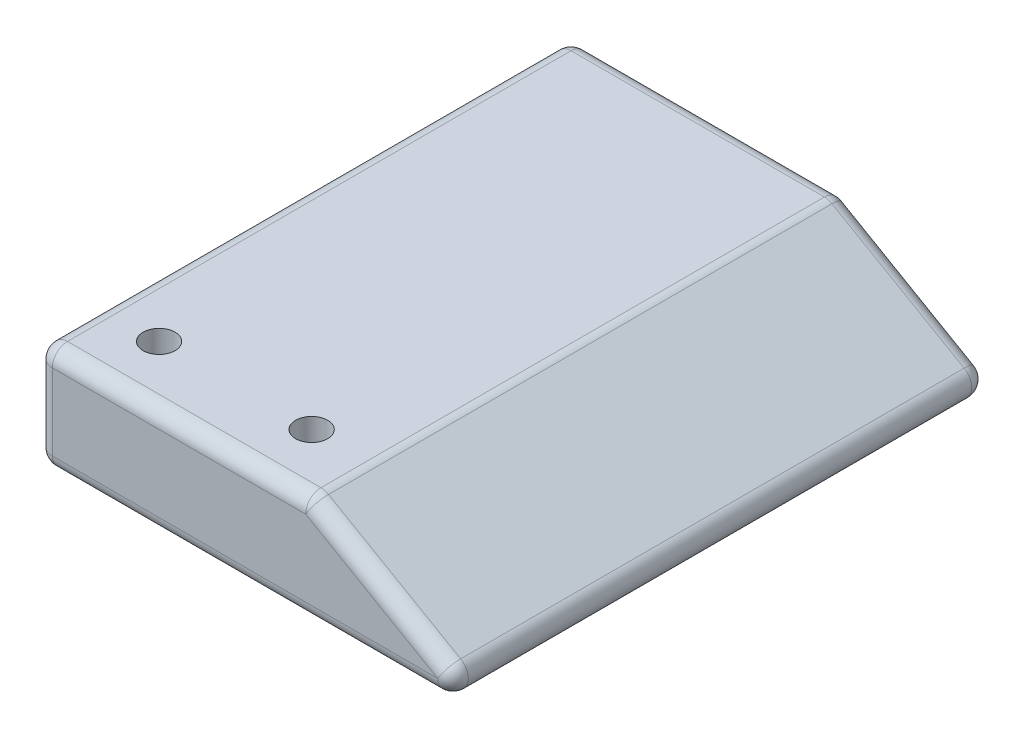
ISO-10303-21;
HEADER;
FILE_DESCRIPTION(('STEP AP214'),'2;1');
FILE_NAME('part.step','',(''),(''),'','','');
FILE_SCHEMA(('AUTOMOTIVE_DESIGN { 1 0 10303 214 1 1 1 1 }'));
ENDSEC;
DATA;
#1=APPLICATION_CONTEXT('core data for automotive mechanical design processes');
#2=APPLICATION_PROTOCOL_DEFINITION('international standard','automotive_design',2000,#1);
#3=PRODUCT_CONTEXT('',#1,'mechanical');
#4=PRODUCT('Part','Part','',(#3));
#5=PRODUCT_RELATED_PRODUCT_CATEGORY('part','',(#4));
#6=PRODUCT_DEFINITION_FORMATION('','',#4);
#7=PRODUCT_DEFINITION_CONTEXT('part definition',#1,'design');
#8=PRODUCT_DEFINITION('design','',#6,#7);
#9=PRODUCT_DEFINITION_SHAPE('','',#8);
#10=(LENGTH_UNIT() NAMED_UNIT(*) SI_UNIT(.MILLI.,.METRE.));
#11=(NAMED_UNIT(*) PLANE_ANGLE_UNIT() SI_UNIT($,.RADIAN.));
#12=(NAMED_UNIT(*) SI_UNIT($,.STERADIAN.) SOLID_ANGLE_UNIT());
#13=UNCERTAINTY_MEASURE_WITH_UNIT(LENGTH_MEASURE(1.E-05),#10,'distance_accuracy_value','');
#14=(GEOMETRIC_REPRESENTATION_CONTEXT(3) GLOBAL_UNCERTAINTY_ASSIGNED_CONTEXT((#13)) GLOBAL_UNIT_ASSIGNED_CONTEXT((#10,
#11,#12)) REPRESENTATION_CONTEXT('',''));
#15=CARTESIAN_POINT('',(0.,0.,0.));
#16=DIRECTION('',(0.,0.,1.));
#17=DIRECTION('',(1.,0.,0.));
#18=AXIS2_PLACEMENT_3D('',#15,#16,#17);
#19=CARTESIAN_POINT('',(60.,0.,70.));
#20=DIRECTION('',(0.,1.,0.));
#21=DIRECTION('',(0.,0.,1.));
#22=AXIS2_PLACEMENT_3D('',#19,#20,#21);
#23=PLANE('',#22);
#24=DIRECTION('',(1.,0.,0.));
#25=VECTOR('',#24,1.);
#26=CARTESIAN_POINT('',(60.,0.,2.));
#27=LINE('',#26,#25);
#28=CARTESIAN_POINT('',(2.,0.,2.));
#29=VERTEX_POINT('',#28);
#30=CARTESIAN_POINT('',(52.5358983848623,0.,2.));
#31=VERTEX_POINT('',#30);
#32=EDGE_CURVE('E183',#29,#31,#27,.T.);
#33=ORIENTED_EDGE('',*,*,#32,.T.);
#34=DIRECTION('',(0.,0.,-1.));
#35=VECTOR('',#34,1.);
#36=CARTESIAN_POINT('',(52.5358983848623,0.,70.));
#37=LINE('',#36,#35);
#38=CARTESIAN_POINT('',(52.5358983848623,0.,68.));
#39=VERTEX_POINT('',#38);
#40=EDGE_CURVE('E186',#31,#39,#37,.F.);
#41=ORIENTED_EDGE('',*,*,#40,.T.);
#42=DIRECTION('',(1.,0.,0.));
#43=VECTOR('',#42,1.);
#44=CARTESIAN_POINT('',(60.,0.,68.));
#45=LINE('',#44,#43);
#46=CARTESIAN_POINT('',(2.,0.,68.));
#47=VERTEX_POINT('',#46);
#48=EDGE_CURVE('E180',#39,#47,#45,.F.);
#49=ORIENTED_EDGE('',*,*,#48,.T.);
#50=DIRECTION('',(0.,0.,-1.));
#51=VECTOR('',#50,1.);
#52=CARTESIAN_POINT('',(2.,0.,70.));
#53=LINE('',#52,#51);
#54=EDGE_CURVE('E177',#47,#29,#53,.T.);
#55=ORIENTED_EDGE('',*,*,#54,.T.);
#56=EDGE_LOOP('',(#33,#41,#49,#55));
#57=FACE_BOUND('',#56,.T.);
#58=ADVANCED_FACE('F45',(#57),#23,.F.);
#59=CARTESIAN_POINT('',(35.7512886940358,14.,70.));
#60=DIRECTION('',(-0.500000000000001,-0.866025403784438,0.));
#61=DIRECTION('',(0.866025403784438,-0.500000000000001,0.));
#62=AXIS2_PLACEMENT_3D('',#59,#60,#61);
#63=PLANE('',#62);
#64=DIRECTION('',(0.,0.,-1.));
#65=VECTOR('',#64,1.);
#66=CARTESIAN_POINT('',(53.5358983848623,3.73205080756888,70.));
#67=LINE('',#66,#65);
#68=CARTESIAN_POINT('',(53.5358983848623,3.73205080756887,68.));
#69=VERTEX_POINT('',#68);
#70=CARTESIAN_POINT('',(53.5358983848623,3.73205080756887,2.));
#71=VERTEX_POINT('',#70);
#72=EDGE_CURVE('E170',#69,#71,#67,.T.);
#73=ORIENTED_EDGE('',*,*,#72,.T.);
#74=DIRECTION('',(-0.866025403784438,0.500000000000001,0.));
#75=VECTOR('',#74,1.);
#76=CARTESIAN_POINT('',(35.7512886940358,14.,2.));
#77=LINE('',#76,#75);
#78=CARTESIAN_POINT('',(36.2153903091736,13.7320508075689,2.));
#79=VERTEX_POINT('',#78);
#80=EDGE_CURVE('E174',#71,#79,#77,.T.);
#81=ORIENTED_EDGE('',*,*,#80,.T.);
#82=DIRECTION('',(0.,0.,-1.));
#83=VECTOR('',#82,1.);
#84=CARTESIAN_POINT('',(36.2153903091736,13.7320508075689,70.));
#85=LINE('',#84,#83);
#86=CARTESIAN_POINT('',(36.2153903091736,13.7320508075689,68.));
#87=VERTEX_POINT('',#86);
#88=EDGE_CURVE('E167',#79,#87,#85,.F.);
#89=ORIENTED_EDGE('',*,*,#88,.T.);
#90=DIRECTION('',(-0.866025403784438,0.500000000000001,0.));
#91=VECTOR('',#90,1.);
#92=CARTESIAN_POINT('',(35.7512886940358,14.,68.));
#93=LINE('',#92,#91);
#94=EDGE_CURVE('E164',#87,#69,#93,.F.);
#95=ORIENTED_EDGE('',*,*,#94,.T.);
#96=EDGE_LOOP('',(#73,#81,#89,#95));
#97=FACE_BOUND('',#96,.T.);
#98=ADVANCED_FACE('F359',(#97),#63,.F.);
#99=CARTESIAN_POINT('',(0.,14.,70.));
#100=DIRECTION('',(0.,-1.,0.));
#101=DIRECTION('',(0.,0.,-1.));
#102=AXIS2_PLACEMENT_3D('',#99,#100,#101);
#103=PLANE('',#102);
#104=CARTESIAN_POINT('',(8.,14.,62.));
#105=DIRECTION('',(0.,1.,0.));
#106=DIRECTION('',(0.,0.,1.));
#107=AXIS2_PLACEMENT_3D('',#104,#105,#106);
#108=CIRCLE('',#107,2.1);
#109=CARTESIAN_POINT('',(8.,14.,64.1));
#110=VERTEX_POINT('',#109);
#111=EDGE_CURVE('E150',#110,#110,#108,.T.);
#112=ORIENTED_EDGE('',*,*,#111,.F.);
#113=EDGE_LOOP('',(#112));
#114=FACE_BOUND('',#113,.T.);
#115=CARTESIAN_POINT('',(28.,14.,62.));
#116=DIRECTION('',(0.,1.,0.));
#117=DIRECTION('',(0.,0.,1.));
#118=AXIS2_PLACEMENT_3D('',#115,#116,#117);
#119=CIRCLE('',#118,2.1);
#120=CARTESIAN_POINT('',(28.,14.,64.1));
#121=VERTEX_POINT('',#120);
#122=EDGE_CURVE('E149',#121,#121,#119,.T.);
#123=ORIENTED_EDGE('',*,*,#122,.F.);
#124=EDGE_LOOP('',(#123));
#125=FACE_BOUND('',#124,.T.);
#126=DIRECTION('',(-1.,0.,0.));
#127=VECTOR('',#126,1.);
#128=CARTESIAN_POINT('',(0.,14.,68.));
#129=LINE('',#128,#127);
#130=CARTESIAN_POINT('',(2.,14.,68.));
#131=VERTEX_POINT('',#130);
#132=CARTESIAN_POINT('',(35.2153903091736,14.,68.));
#133=VERTEX_POINT('',#132);
#134=EDGE_CURVE('E193',#131,#133,#129,.F.);
#135=ORIENTED_EDGE('',*,*,#134,.T.);
#136=DIRECTION('',(0.,0.,-1.));
#137=VECTOR('',#136,1.);
#138=CARTESIAN_POINT('',(35.2153903091736,14.,70.));
#139=LINE('',#138,#137);
#140=CARTESIAN_POINT('',(35.2153903091736,14.,2.));
#141=VERTEX_POINT('',#140);
#142=EDGE_CURVE('E199',#133,#141,#139,.T.);
#143=ORIENTED_EDGE('',*,*,#142,.T.);
#144=DIRECTION('',(-1.,0.,0.));
#145=VECTOR('',#144,1.);
#146=CARTESIAN_POINT('',(0.,14.,2.));
#147=LINE('',#146,#145);
#148=CARTESIAN_POINT('',(2.,14.,2.));
#149=VERTEX_POINT('',#148);
#150=EDGE_CURVE('E196',#141,#149,#147,.T.);
#151=ORIENTED_EDGE('',*,*,#150,.T.);
#152=DIRECTION('',(0.,0.,-1.));
#153=VECTOR('',#152,1.);
#154=CARTESIAN_POINT('',(2.,14.,70.));
#155=LINE('',#154,#153);
#156=EDGE_CURVE('E190',#149,#131,#155,.F.);
#157=ORIENTED_EDGE('',*,*,#156,.T.);
#158=EDGE_LOOP('',(#135,#143,#151,#157));
#159=FACE_BOUND('',#158,.T.);
#160=ADVANCED_FACE('F369',(#114,#125,#159),#103,.F.);
#161=CARTESIAN_POINT('',(0.,0.,70.));
#162=DIRECTION('',(1.,0.,0.));
#163=DIRECTION('',(0.,0.,-1.));
#164=AXIS2_PLACEMENT_3D('',#161,#162,#163);
#165=PLANE('',#164);
#166=DIRECTION('',(0.,-1.,0.));
#167=VECTOR('',#166,1.);
#168=CARTESIAN_POINT('',(0.,0.,68.));
#169=LINE('',#168,#167);
#170=CARTESIAN_POINT('',(0.,2.,68.));
#171=VERTEX_POINT('',#170);
#172=CARTESIAN_POINT('',(0.,12.,68.));
#173=VERTEX_POINT('',#172);
#174=EDGE_CURVE('E55',#171,#173,#169,.F.);
#175=ORIENTED_EDGE('',*,*,#174,.T.);
#176=DIRECTION('',(0.,0.,-1.));
#177=VECTOR('',#176,1.);
#178=CARTESIAN_POINT('',(0.,12.,70.));
#179=LINE('',#178,#177);
#180=CARTESIAN_POINT('',(0.,12.,2.));
#181=VERTEX_POINT('',#180);
#182=EDGE_CURVE('E11',#173,#181,#179,.T.);
#183=ORIENTED_EDGE('',*,*,#182,.T.);
#184=DIRECTION('',(0.,-1.,0.));
#185=VECTOR('',#184,1.);
#186=CARTESIAN_POINT('',(0.,0.,2.));
#187=LINE('',#186,#185);
#188=CARTESIAN_POINT('',(0.,2.,2.));
#189=VERTEX_POINT('',#188);
#190=EDGE_CURVE('E229',#181,#189,#187,.T.);
#191=ORIENTED_EDGE('',*,*,#190,.T.);
#192=DIRECTION('',(0.,0.,-1.));
#193=VECTOR('',#192,1.);
#194=CARTESIAN_POINT('',(0.,2.,70.));
#195=LINE('',#194,#193);
#196=EDGE_CURVE('E66',#189,#171,#195,.F.);
#197=ORIENTED_EDGE('',*,*,#196,.T.);
#198=EDGE_LOOP('',(#175,#183,#191,#197));
#199=FACE_BOUND('',#198,.T.);
#200=ADVANCED_FACE('F370',(#199),#165,.F.);
#201=CARTESIAN_POINT('',(0.,0.,70.));
#202=DIRECTION('',(0.,0.,-1.));
#203=DIRECTION('',(-1.,0.,0.));
#204=AXIS2_PLACEMENT_3D('',#201,#202,#203);
#205=PLANE('',#204);
#206=DIRECTION('',(-0.866025403784438,0.500000000000001,0.));
#207=VECTOR('',#206,1.);
#208=CARTESIAN_POINT('',(14.0000000000001,24.2487113059643,70.));
#209=LINE('',#208,#207);
#210=CARTESIAN_POINT('',(52.5358983848623,2.,70.));
#211=VERTEX_POINT('',#210);
#212=CARTESIAN_POINT('',(35.2153903091736,12.,70.));
#213=VERTEX_POINT('',#212);
#214=EDGE_CURVE('E222',#211,#213,#209,.T.);
#215=ORIENTED_EDGE('',*,*,#214,.T.);
#216=DIRECTION('',(-1.,0.,0.));
#217=VECTOR('',#216,1.);
#218=CARTESIAN_POINT('',(0.,12.,70.));
#219=LINE('',#218,#217);
#220=CARTESIAN_POINT('',(2.,12.,70.));
#221=VERTEX_POINT('',#220);
#222=EDGE_CURVE('E225',#213,#221,#219,.T.);
#223=ORIENTED_EDGE('',*,*,#222,.T.);
#224=DIRECTION('',(0.,-1.,0.));
#225=VECTOR('',#224,1.);
#226=CARTESIAN_POINT('',(2.,0.,70.));
#227=LINE('',#226,#225);
#228=CARTESIAN_POINT('',(2.,2.,70.));
#229=VERTEX_POINT('',#228);
#230=EDGE_CURVE('E216',#221,#229,#227,.T.);
#231=ORIENTED_EDGE('',*,*,#230,.T.);
#232=DIRECTION('',(1.,0.,0.));
#233=VECTOR('',#232,1.);
#234=CARTESIAN_POINT('',(0.,2.,70.));
#235=LINE('',#234,#233);
#236=EDGE_CURVE('E219',#229,#211,#235,.T.);
#237=ORIENTED_EDGE('',*,*,#236,.T.);
#238=EDGE_LOOP('',(#215,#223,#231,#237));
#239=FACE_BOUND('',#238,.T.);
#240=ADVANCED_FACE('F341',(#239),#205,.F.);
#241=CARTESIAN_POINT('',(0.,0.,0.));
#242=DIRECTION('',(0.,0.,-1.));
#243=DIRECTION('',(-1.,0.,0.));
#244=AXIS2_PLACEMENT_3D('',#241,#242,#243);
#245=PLANE('',#244);
#246=DIRECTION('',(-1.,0.,0.));
#247=VECTOR('',#246,1.);
#248=CARTESIAN_POINT('',(35.7512886940358,12.,0.));
#249=LINE('',#248,#247);
#250=CARTESIAN_POINT('',(2.,12.,0.));
#251=VERTEX_POINT('',#250);
#252=CARTESIAN_POINT('',(35.2153903091736,12.,0.));
#253=VERTEX_POINT('',#252);
#254=EDGE_CURVE('E209',#251,#253,#249,.F.);
#255=ORIENTED_EDGE('',*,*,#254,.T.);
#256=DIRECTION('',(-0.866025403784438,0.500000000000001,0.));
#257=VECTOR('',#256,1.);
#258=CARTESIAN_POINT('',(59.,-1.73205080756888,0.));
#259=LINE('',#258,#257);
#260=CARTESIAN_POINT('',(52.5358983848623,2.,0.));
#261=VERTEX_POINT('',#260);
#262=EDGE_CURVE('E212',#253,#261,#259,.F.);
#263=ORIENTED_EDGE('',*,*,#262,.T.);
#264=DIRECTION('',(1.,0.,0.));
#265=VECTOR('',#264,1.);
#266=CARTESIAN_POINT('',(0.,2.,0.));
#267=LINE('',#266,#265);
#268=CARTESIAN_POINT('',(2.,2.,0.));
#269=VERTEX_POINT('',#268);
#270=EDGE_CURVE('E206',#261,#269,#267,.F.);
#271=ORIENTED_EDGE('',*,*,#270,.T.);
#272=DIRECTION('',(0.,-1.,0.));
#273=VECTOR('',#272,1.);
#274=CARTESIAN_POINT('',(2.,14.,0.));
#275=LINE('',#274,#273);
#276=EDGE_CURVE('E203',#269,#251,#275,.F.);
#277=ORIENTED_EDGE('',*,*,#276,.T.);
#278=EDGE_LOOP('',(#255,#263,#271,#277));
#279=FACE_BOUND('',#278,.T.);
#280=ADVANCED_FACE('F575',(#279),#245,.T.);
#281=CARTESIAN_POINT('',(2.,12.,70.));
#282=DIRECTION('',(0.,0.,-1.));
#283=DIRECTION('',(-1.,0.,0.));
#284=AXIS2_PLACEMENT_3D('',#281,#282,#283);
#285=CYLINDRICAL_SURFACE('',#284,2.);
#286=CARTESIAN_POINT('',(2.,12.,68.));
#287=DIRECTION('',(0.,0.,1.));
#288=DIRECTION('',(1.,0.,0.));
#289=AXIS2_PLACEMENT_3D('',#286,#287,#288);
#290=CIRCLE('',#289,2.);
#291=EDGE_CURVE('E49',#131,#173,#290,.T.);
#292=ORIENTED_EDGE('',*,*,#291,.F.);
#293=ORIENTED_EDGE('',*,*,#156,.F.);
#294=CARTESIAN_POINT('',(2.,12.,2.));
#295=DIRECTION('',(0.,0.,-1.));
#296=DIRECTION('',(-1.,0.,0.));
#297=AXIS2_PLACEMENT_3D('',#294,#295,#296);
#298=CIRCLE('',#297,2.);
#299=EDGE_CURVE('E318',#181,#149,#298,.T.);
#300=ORIENTED_EDGE('',*,*,#299,.F.);
#301=ORIENTED_EDGE('',*,*,#182,.F.);
#302=EDGE_LOOP('',(#292,#293,#300,#301));
#303=FACE_BOUND('',#302,.T.);
#304=ADVANCED_FACE('F47',(#303),#285,.T.);
#305=CARTESIAN_POINT('',(2.,12.,68.));
#306=DIRECTION('',(0.,0.,1.));
#307=DIRECTION('',(1.,0.,0.));
#308=AXIS2_PLACEMENT_3D('',#305,#306,#307);
#309=SPHERICAL_SURFACE('',#308,2.);
#310=CARTESIAN_POINT('',(2.,12.,68.));
#311=DIRECTION('',(-1.,0.,0.));
#312=DIRECTION('',(0.,0.,1.));
#313=AXIS2_PLACEMENT_3D('',#310,#311,#312);
#314=CIRCLE('',#313,2.);
#315=EDGE_CURVE('E311',#131,#221,#314,.F.);
#316=ORIENTED_EDGE('',*,*,#315,.F.);
#317=ORIENTED_EDGE('',*,*,#291,.T.);
#318=CARTESIAN_POINT('',(2.,12.,68.));
#319=DIRECTION('',(0.,1.,0.));
#320=DIRECTION('',(0.,0.,1.));
#321=AXIS2_PLACEMENT_3D('',#318,#319,#320);
#322=CIRCLE('',#321,2.);
#323=EDGE_CURVE('E315',#221,#173,#322,.F.);
#324=ORIENTED_EDGE('',*,*,#323,.F.);
#325=EDGE_LOOP('',(#316,#317,#324));
#326=FACE_BOUND('',#325,.T.);
#327=ADVANCED_FACE('F331',(#326),#309,.T.);
#328=CARTESIAN_POINT('',(2.,12.,2.));
#329=DIRECTION('',(0.,0.,1.));
#330=DIRECTION('',(1.,0.,0.));
#331=AXIS2_PLACEMENT_3D('',#328,#329,#330);
#332=SPHERICAL_SURFACE('',#331,2.);
#333=CARTESIAN_POINT('',(2.,12.,2.));
#334=DIRECTION('',(0.,1.,0.));
#335=DIRECTION('',(0.,0.,1.));
#336=AXIS2_PLACEMENT_3D('',#333,#334,#335);
#337=CIRCLE('',#336,2.);
#338=EDGE_CURVE('E303',#181,#251,#337,.F.);
#339=ORIENTED_EDGE('',*,*,#338,.F.);
#340=ORIENTED_EDGE('',*,*,#299,.T.);
#341=CARTESIAN_POINT('',(2.,12.,2.));
#342=DIRECTION('',(-1.,0.,0.));
#343=DIRECTION('',(0.,0.,1.));
#344=AXIS2_PLACEMENT_3D('',#341,#342,#343);
#345=CIRCLE('',#344,2.);
#346=EDGE_CURVE('E307',#251,#149,#345,.F.);
#347=ORIENTED_EDGE('',*,*,#346,.F.);
#348=EDGE_LOOP('',(#339,#340,#347));
#349=FACE_BOUND('',#348,.T.);
#350=ADVANCED_FACE('F412',(#349),#332,.T.);
#351=CARTESIAN_POINT('',(2.,0.,68.));
#352=DIRECTION('',(0.,-1.,0.));
#353=DIRECTION('',(0.,0.,-1.));
#354=AXIS2_PLACEMENT_3D('',#351,#352,#353);
#355=CYLINDRICAL_SURFACE('',#354,2.);
#356=ORIENTED_EDGE('',*,*,#323,.T.);
#357=ORIENTED_EDGE('',*,*,#174,.F.);
#358=CARTESIAN_POINT('',(2.,2.,68.));
#359=DIRECTION('',(0.,-1.,0.));
#360=DIRECTION('',(0.,0.,-1.));
#361=AXIS2_PLACEMENT_3D('',#358,#359,#360);
#362=CIRCLE('',#361,2.);
#363=EDGE_CURVE('E295',#229,#171,#362,.T.);
#364=ORIENTED_EDGE('',*,*,#363,.F.);
#365=ORIENTED_EDGE('',*,*,#230,.F.);
#366=EDGE_LOOP('',(#356,#357,#364,#365));
#367=FACE_BOUND('',#366,.T.);
#368=ADVANCED_FACE('F336',(#367),#355,.T.);
#369=CARTESIAN_POINT('',(0.,12.,68.));
#370=DIRECTION('',(-1.,0.,0.));
#371=DIRECTION('',(0.,0.,1.));
#372=AXIS2_PLACEMENT_3D('',#369,#370,#371);
#373=CYLINDRICAL_SURFACE('',#372,2.);
#374=ORIENTED_EDGE('',*,*,#315,.T.);
#375=ORIENTED_EDGE('',*,*,#222,.F.);
#376=CARTESIAN_POINT('',(35.2153903091736,12.,68.));
#377=DIRECTION('',(1.,0.,0.));
#378=DIRECTION('',(0.,0.,-1.));
#379=AXIS2_PLACEMENT_3D('',#376,#377,#378);
#380=CIRCLE('',#379,2.);
#381=EDGE_CURVE('E291',#133,#213,#380,.T.);
#382=ORIENTED_EDGE('',*,*,#381,.F.);
#383=ORIENTED_EDGE('',*,*,#134,.F.);
#384=EDGE_LOOP('',(#374,#375,#382,#383));
#385=FACE_BOUND('',#384,.T.);
#386=ADVANCED_FACE('F347',(#385),#373,.T.);
#387=CARTESIAN_POINT('',(35.2153903091736,12.,70.));
#388=DIRECTION('',(0.,0.,-1.));
#389=DIRECTION('',(-1.,0.,0.));
#390=AXIS2_PLACEMENT_3D('',#387,#388,#389);
#391=CYLINDRICAL_SURFACE('',#390,2.);
#392=CARTESIAN_POINT('',(35.2153903091736,12.,2.));
#393=DIRECTION('',(0.,0.,-1.));
#394=DIRECTION('',(-1.,0.,0.));
#395=AXIS2_PLACEMENT_3D('',#392,#393,#394);
#396=CIRCLE('',#395,2.);
#397=EDGE_CURVE('E283',#141,#79,#396,.T.);
#398=ORIENTED_EDGE('',*,*,#397,.F.);
#399=ORIENTED_EDGE('',*,*,#142,.F.);
#400=CARTESIAN_POINT('',(35.2153903091736,12.,68.));
#401=DIRECTION('',(0.,0.,1.));
#402=DIRECTION('',(1.,0.,0.));
#403=AXIS2_PLACEMENT_3D('',#400,#401,#402);
#404=CIRCLE('',#403,2.);
#405=EDGE_CURVE('E287',#87,#133,#404,.T.);
#406=ORIENTED_EDGE('',*,*,#405,.F.);
#407=ORIENTED_EDGE('',*,*,#88,.F.);
#408=EDGE_LOOP('',(#398,#399,#406,#407));
#409=FACE_BOUND('',#408,.T.);
#410=ADVANCED_FACE('F366',(#409),#391,.T.);
#411=CARTESIAN_POINT('',(0.,12.,2.));
#412=DIRECTION('',(1.,0.,0.));
#413=DIRECTION('',(0.,0.,-1.));
#414=AXIS2_PLACEMENT_3D('',#411,#412,#413);
#415=CYLINDRICAL_SURFACE('',#414,2.);
#416=ORIENTED_EDGE('',*,*,#346,.T.);
#417=ORIENTED_EDGE('',*,*,#150,.F.);
#418=CARTESIAN_POINT('',(35.2153903091736,12.,2.));
#419=DIRECTION('',(1.,0.,0.));
#420=DIRECTION('',(0.,0.,-1.));
#421=AXIS2_PLACEMENT_3D('',#418,#419,#420);
#422=CIRCLE('',#421,2.);
#423=EDGE_CURVE('E280',#253,#141,#422,.T.);
#424=ORIENTED_EDGE('',*,*,#423,.F.);
#425=ORIENTED_EDGE('',*,*,#254,.F.);
#426=EDGE_LOOP('',(#416,#417,#424,#425));
#427=FACE_BOUND('',#426,.T.);
#428=ADVANCED_FACE('F411',(#427),#415,.T.);
#429=CARTESIAN_POINT('',(2.,0.,2.));
#430=DIRECTION('',(0.,1.,0.));
#431=DIRECTION('',(0.,0.,1.));
#432=AXIS2_PLACEMENT_3D('',#429,#430,#431);
#433=CYLINDRICAL_SURFACE('',#432,2.);
#434=ORIENTED_EDGE('',*,*,#338,.T.);
#435=ORIENTED_EDGE('',*,*,#276,.F.);
#436=CARTESIAN_POINT('',(2.,2.,2.));
#437=DIRECTION('',(0.,-1.,0.));
#438=DIRECTION('',(0.,0.,-1.));
#439=AXIS2_PLACEMENT_3D('',#436,#437,#438);
#440=CIRCLE('',#439,2.);
#441=EDGE_CURVE('E276',#189,#269,#440,.T.);
#442=ORIENTED_EDGE('',*,*,#441,.F.);
#443=ORIENTED_EDGE('',*,*,#190,.F.);
#444=EDGE_LOOP('',(#434,#435,#442,#443));
#445=FACE_BOUND('',#444,.T.);
#446=ADVANCED_FACE('F379',(#445),#433,.T.);
#447=CARTESIAN_POINT('',(2.,2.,70.));
#448=DIRECTION('',(0.,0.,-1.));
#449=DIRECTION('',(-1.,0.,0.));
#450=AXIS2_PLACEMENT_3D('',#447,#448,#449);
#451=CYLINDRICAL_SURFACE('',#450,2.);
#452=CARTESIAN_POINT('',(2.,2.,68.));
#453=DIRECTION('',(0.,0.,1.));
#454=DIRECTION('',(1.,0.,0.));
#455=AXIS2_PLACEMENT_3D('',#452,#453,#454);
#456=CIRCLE('',#455,2.);
#457=EDGE_CURVE('E299',#171,#47,#456,.T.);
#458=ORIENTED_EDGE('',*,*,#457,.F.);
#459=ORIENTED_EDGE('',*,*,#196,.F.);
#460=CARTESIAN_POINT('',(2.,2.,2.));
#461=DIRECTION('',(0.,0.,-1.));
#462=DIRECTION('',(-1.,0.,0.));
#463=AXIS2_PLACEMENT_3D('',#460,#461,#462);
#464=CIRCLE('',#463,2.);
#465=EDGE_CURVE('E272',#29,#189,#464,.T.);
#466=ORIENTED_EDGE('',*,*,#465,.F.);
#467=ORIENTED_EDGE('',*,*,#54,.F.);
#468=EDGE_LOOP('',(#458,#459,#466,#467));
#469=FACE_BOUND('',#468,.T.);
#470=ADVANCED_FACE('F375',(#469),#451,.T.);
#471=CARTESIAN_POINT('',(2.,2.,68.));
#472=DIRECTION('',(0.,0.,1.));
#473=DIRECTION('',(1.,0.,0.));
#474=AXIS2_PLACEMENT_3D('',#471,#472,#473);
#475=SPHERICAL_SURFACE('',#474,2.);
#476=ORIENTED_EDGE('',*,*,#363,.T.);
#477=ORIENTED_EDGE('',*,*,#457,.T.);
#478=CARTESIAN_POINT('',(2.,2.,68.));
#479=DIRECTION('',(-1.,0.,0.));
#480=DIRECTION('',(0.,0.,1.));
#481=AXIS2_PLACEMENT_3D('',#478,#479,#480);
#482=CIRCLE('',#481,2.);
#483=EDGE_CURVE('E268',#229,#47,#482,.F.);
#484=ORIENTED_EDGE('',*,*,#483,.F.);
#485=EDGE_LOOP('',(#476,#477,#484));
#486=FACE_BOUND('',#485,.T.);
#487=ADVANCED_FACE('F391',(#486),#475,.T.);
#488=CARTESIAN_POINT('',(35.2153903091736,12.,68.));
#489=DIRECTION('',(0.,0.,1.));
#490=DIRECTION('',(1.,0.,0.));
#491=AXIS2_PLACEMENT_3D('',#488,#489,#490);
#492=SPHERICAL_SURFACE('',#491,2.);
#493=ORIENTED_EDGE('',*,*,#405,.T.);
#494=ORIENTED_EDGE('',*,*,#381,.T.);
#495=CARTESIAN_POINT('',(35.2153903091736,12.,68.));
#496=DIRECTION('',(-0.866025403784437,0.500000000000003,0.));
#497=DIRECTION('',(-0.500000000000003,-0.866025403784437,0.));
#498=AXIS2_PLACEMENT_3D('',#495,#496,#497);
#499=CIRCLE('',#498,2.);
#500=EDGE_CURVE('E264',#87,#213,#499,.F.);
#501=ORIENTED_EDGE('',*,*,#500,.F.);
#502=EDGE_LOOP('',(#493,#494,#501));
#503=FACE_BOUND('',#502,.T.);
#504=ADVANCED_FACE('F350',(#503),#492,.T.);
#505=CARTESIAN_POINT('',(35.2153903091736,12.,2.));
#506=DIRECTION('',(0.,0.,1.));
#507=DIRECTION('',(1.,0.,0.));
#508=AXIS2_PLACEMENT_3D('',#505,#506,#507);
#509=SPHERICAL_SURFACE('',#508,2.);
#510=ORIENTED_EDGE('',*,*,#423,.T.);
#511=ORIENTED_EDGE('',*,*,#397,.T.);
#512=CARTESIAN_POINT('',(35.2153903091736,12.,2.));
#513=DIRECTION('',(-0.866025403784438,0.500000000000001,0.));
#514=DIRECTION('',(-0.500000000000001,-0.866025403784438,0.));
#515=AXIS2_PLACEMENT_3D('',#512,#513,#514);
#516=CIRCLE('',#515,2.);
#517=EDGE_CURVE('E260',#253,#79,#516,.F.);
#518=ORIENTED_EDGE('',*,*,#517,.F.);
#519=EDGE_LOOP('',(#510,#511,#518));
#520=FACE_BOUND('',#519,.T.);
#521=ADVANCED_FACE('F407',(#520),#509,.T.);
#522=CARTESIAN_POINT('',(2.,2.,2.));
#523=DIRECTION('',(0.,0.,1.));
#524=DIRECTION('',(1.,0.,0.));
#525=AXIS2_PLACEMENT_3D('',#522,#523,#524);
#526=SPHERICAL_SURFACE('',#525,2.);
#527=ORIENTED_EDGE('',*,*,#465,.T.);
#528=ORIENTED_EDGE('',*,*,#441,.T.);
#529=CARTESIAN_POINT('',(2.,2.,2.));
#530=DIRECTION('',(-1.,0.,0.));
#531=DIRECTION('',(0.,-1.,0.));
#532=AXIS2_PLACEMENT_3D('',#529,#530,#531);
#533=CIRCLE('',#532,2.);
#534=EDGE_CURVE('E256',#29,#269,#533,.F.);
#535=ORIENTED_EDGE('',*,*,#534,.F.);
#536=EDGE_LOOP('',(#527,#528,#535));
#537=FACE_BOUND('',#536,.T.);
#538=ADVANCED_FACE('F381',(#537),#526,.T.);
#539=CARTESIAN_POINT('',(0.,2.,68.));
#540=DIRECTION('',(1.,0.,0.));
#541=DIRECTION('',(0.,0.,-1.));
#542=AXIS2_PLACEMENT_3D('',#539,#540,#541);
#543=CYLINDRICAL_SURFACE('',#542,2.);
#544=ORIENTED_EDGE('',*,*,#483,.T.);
#545=ORIENTED_EDGE('',*,*,#48,.F.);
#546=CARTESIAN_POINT('',(52.5358983848623,2.,68.));
#547=DIRECTION('',(1.,0.,0.));
#548=DIRECTION('',(0.,1.,0.));
#549=AXIS2_PLACEMENT_3D('',#546,#547,#548);
#550=CIRCLE('',#549,2.);
#551=EDGE_CURVE('E252',#211,#39,#550,.T.);
#552=ORIENTED_EDGE('',*,*,#551,.F.);
#553=ORIENTED_EDGE('',*,*,#236,.F.);
#554=EDGE_LOOP('',(#544,#545,#552,#553));
#555=FACE_BOUND('',#554,.T.);
#556=ADVANCED_FACE('F393',(#555),#543,.T.);
#557=CARTESIAN_POINT('',(14.0000000000001,24.2487113059643,68.));
#558=DIRECTION('',(-0.866025403784438,0.500000000000001,0.));
#559=DIRECTION('',(-0.500000000000001,-0.866025403784438,0.));
#560=AXIS2_PLACEMENT_3D('',#557,#558,#559);
#561=CYLINDRICAL_SURFACE('',#560,2.);
#562=ORIENTED_EDGE('',*,*,#500,.T.);
#563=ORIENTED_EDGE('',*,*,#214,.F.);
#564=CARTESIAN_POINT('',(52.5358983848623,2.,68.));
#565=DIRECTION('',(0.866025403784438,-0.500000000000001,0.));
#566=DIRECTION('',(0.500000000000001,0.866025403784438,0.));
#567=AXIS2_PLACEMENT_3D('',#564,#565,#566);
#568=CIRCLE('',#567,2.);
#569=EDGE_CURVE('E248',#69,#211,#568,.T.);
#570=ORIENTED_EDGE('',*,*,#569,.F.);
#571=ORIENTED_EDGE('',*,*,#94,.F.);
#572=EDGE_LOOP('',(#562,#563,#570,#571));
#573=FACE_BOUND('',#572,.T.);
#574=ADVANCED_FACE('F354',(#573),#561,.T.);
#575=CARTESIAN_POINT('',(34.7512886940358,12.2679491924311,2.));
#576=DIRECTION('',(0.866025403784438,-0.500000000000001,0.));
#577=DIRECTION('',(0.500000000000001,0.866025403784438,0.));
#578=AXIS2_PLACEMENT_3D('',#575,#576,#577);
#579=CYLINDRICAL_SURFACE('',#578,2.);
#580=ORIENTED_EDGE('',*,*,#517,.T.);
#581=ORIENTED_EDGE('',*,*,#80,.F.);
#582=CARTESIAN_POINT('',(52.5358983848623,2.,2.));
#583=DIRECTION('',(0.866025403784436,-0.500000000000003,0.));
#584=DIRECTION('',(0.500000000000004,0.866025403784437,0.));
#585=AXIS2_PLACEMENT_3D('',#582,#583,#584);
#586=CIRCLE('',#585,2.);
#587=EDGE_CURVE('E244',#261,#71,#586,.T.);
#588=ORIENTED_EDGE('',*,*,#587,.F.);
#589=ORIENTED_EDGE('',*,*,#262,.F.);
#590=EDGE_LOOP('',(#580,#581,#588,#589));
#591=FACE_BOUND('',#590,.T.);
#592=ADVANCED_FACE('F404',(#591),#579,.T.);
#593=CARTESIAN_POINT('',(60.,2.,2.));
#594=DIRECTION('',(-1.,0.,0.));
#595=DIRECTION('',(0.,0.,1.));
#596=AXIS2_PLACEMENT_3D('',#593,#594,#595);
#597=CYLINDRICAL_SURFACE('',#596,2.);
#598=ORIENTED_EDGE('',*,*,#534,.T.);
#599=ORIENTED_EDGE('',*,*,#270,.F.);
#600=CARTESIAN_POINT('',(52.5358983848623,2.,2.));
#601=DIRECTION('',(1.,0.,0.));
#602=DIRECTION('',(0.,0.,-1.));
#603=AXIS2_PLACEMENT_3D('',#600,#601,#602);
#604=CIRCLE('',#603,2.);
#605=EDGE_CURVE('E241',#31,#261,#604,.T.);
#606=ORIENTED_EDGE('',*,*,#605,.F.);
#607=ORIENTED_EDGE('',*,*,#32,.F.);
#608=EDGE_LOOP('',(#598,#599,#606,#607));
#609=FACE_BOUND('',#608,.T.);
#610=ADVANCED_FACE('F386',(#609),#597,.T.);
#611=CARTESIAN_POINT('',(52.5358983848623,2.,68.));
#612=DIRECTION('',(0.,0.,1.));
#613=DIRECTION('',(1.,0.,0.));
#614=AXIS2_PLACEMENT_3D('',#611,#612,#613);
#615=SPHERICAL_SURFACE('',#614,2.);
#616=ORIENTED_EDGE('',*,*,#569,.T.);
#617=ORIENTED_EDGE('',*,*,#551,.T.);
#618=CARTESIAN_POINT('',(52.5358983848623,2.,68.));
#619=DIRECTION('',(0.,0.,1.));
#620=DIRECTION('',(1.,0.,0.));
#621=AXIS2_PLACEMENT_3D('',#618,#619,#620);
#622=CIRCLE('',#621,2.);
#623=EDGE_CURVE('E238',#69,#39,#622,.F.);
#624=ORIENTED_EDGE('',*,*,#623,.F.);
#625=EDGE_LOOP('',(#616,#617,#624));
#626=FACE_BOUND('',#625,.T.);
#627=ADVANCED_FACE('F395',(#626),#615,.T.);
#628=CARTESIAN_POINT('',(52.5358983848623,2.,2.));
#629=DIRECTION('',(0.,0.,1.));
#630=DIRECTION('',(1.,0.,0.));
#631=AXIS2_PLACEMENT_3D('',#628,#629,#630);
#632=SPHERICAL_SURFACE('',#631,2.);
#633=ORIENTED_EDGE('',*,*,#605,.T.);
#634=ORIENTED_EDGE('',*,*,#587,.T.);
#635=CARTESIAN_POINT('',(52.5358983848623,2.,2.));
#636=DIRECTION('',(0.,0.,-1.));
#637=DIRECTION('',(-1.,0.,0.));
#638=AXIS2_PLACEMENT_3D('',#635,#636,#637);
#639=CIRCLE('',#638,2.);
#640=EDGE_CURVE('E163',#31,#71,#639,.F.);
#641=ORIENTED_EDGE('',*,*,#640,.F.);
#642=EDGE_LOOP('',(#633,#634,#641));
#643=FACE_BOUND('',#642,.T.);
#644=ADVANCED_FACE('F401',(#643),#632,.T.);
#645=CARTESIAN_POINT('',(52.5358983848623,2.,70.));
#646=DIRECTION('',(0.,0.,-1.));
#647=DIRECTION('',(-1.,0.,0.));
#648=AXIS2_PLACEMENT_3D('',#645,#646,#647);
#649=CYLINDRICAL_SURFACE('',#648,2.);
#650=ORIENTED_EDGE('',*,*,#623,.T.);
#651=ORIENTED_EDGE('',*,*,#40,.F.);
#652=ORIENTED_EDGE('',*,*,#640,.T.);
#653=ORIENTED_EDGE('',*,*,#72,.F.);
#654=EDGE_LOOP('',(#650,#651,#652,#653));
#655=FACE_BOUND('',#654,.T.);
#656=ADVANCED_FACE('F397',(#655),#649,.T.);
#657=CARTESIAN_POINT('',(28.,1.49999999999999,62.));
#658=DIRECTION('',(0.,1.,0.));
#659=DIRECTION('',(0.,0.,1.));
#660=AXIS2_PLACEMENT_3D('',#657,#658,#659);
#661=CONICAL_SURFACE('',#660,2.1,1.02974425867665);
#662=CARTESIAN_POINT('',(28.,0.238192700042116,62.));
#663=VERTEX_POINT('',#662);
#664=VERTEX_LOOP('',#663);
#665=FACE_BOUND('',#664,.T.);
#666=CARTESIAN_POINT('',(28.,1.49999999999999,62.));
#667=DIRECTION('',(0.,1.,0.));
#668=DIRECTION('',(0.,0.,1.));
#669=AXIS2_PLACEMENT_3D('',#666,#667,#668);
#670=CIRCLE('',#669,2.1);
#671=CARTESIAN_POINT('',(28.,1.49999999999999,64.1));
#672=VERTEX_POINT('',#671);
#673=EDGE_CURVE('E155',#672,#672,#670,.T.);
#674=ORIENTED_EDGE('',*,*,#673,.T.);
#675=EDGE_LOOP('',(#674));
#676=FACE_BOUND('',#675,.T.);
#677=ADVANCED_FACE('F430',(#665,#676),#661,.F.);
#678=CARTESIAN_POINT('',(28.,14.,62.));
#679=DIRECTION('',(0.,1.,0.));
#680=DIRECTION('',(0.,0.,1.));
#681=AXIS2_PLACEMENT_3D('',#678,#679,#680);
#682=CYLINDRICAL_SURFACE('',#681,2.1);
#683=ORIENTED_EDGE('',*,*,#673,.F.);
#684=EDGE_LOOP('',(#683));
#685=FACE_BOUND('',#684,.T.);
#686=ORIENTED_EDGE('',*,*,#122,.T.);
#687=EDGE_LOOP('',(#686));
#688=FACE_BOUND('',#687,.T.);
#689=ADVANCED_FACE('F142',(#685,#688),#682,.F.);
#690=CARTESIAN_POINT('',(8.,1.49999999999999,62.));
#691=DIRECTION('',(0.,1.,0.));
#692=DIRECTION('',(0.,0.,1.));
#693=AXIS2_PLACEMENT_3D('',#690,#691,#692);
#694=CONICAL_SURFACE('',#693,2.1,1.02974425867665);
#695=CARTESIAN_POINT('',(8.,0.238192700042116,62.));
#696=VERTEX_POINT('',#695);
#697=VERTEX_LOOP('',#696);
#698=FACE_BOUND('',#697,.T.);
#699=CARTESIAN_POINT('',(8.,1.49999999999999,62.));
#700=DIRECTION('',(0.,1.,0.));
#701=DIRECTION('',(0.,0.,1.));
#702=AXIS2_PLACEMENT_3D('',#699,#700,#701);
#703=CIRCLE('',#702,2.1);
#704=CARTESIAN_POINT('',(8.,1.49999999999999,64.1));
#705=VERTEX_POINT('',#704);
#706=EDGE_CURVE('E146',#705,#705,#703,.T.);
#707=ORIENTED_EDGE('',*,*,#706,.T.);
#708=EDGE_LOOP('',(#707));
#709=FACE_BOUND('',#708,.T.);
#710=ADVANCED_FACE('F138',(#698,#709),#694,.F.);
#711=CARTESIAN_POINT('',(8.,14.,62.));
#712=DIRECTION('',(0.,1.,0.));
#713=DIRECTION('',(0.,0.,1.));
#714=AXIS2_PLACEMENT_3D('',#711,#712,#713);
#715=CYLINDRICAL_SURFACE('',#714,2.1);
#716=ORIENTED_EDGE('',*,*,#706,.F.);
#717=EDGE_LOOP('',(#716));
#718=FACE_BOUND('',#717,.T.);
#719=ORIENTED_EDGE('',*,*,#111,.T.);
#720=EDGE_LOOP('',(#719));
#721=FACE_BOUND('',#720,.T.);
#722=ADVANCED_FACE('F141',(#718,#721),#715,.F.);
#723=CLOSED_SHELL('',(#58,#98,#160,#200,#240,#280,#304,#327,#350,#368,#386,#410,#428,#446,#470,
#487,#504,#521,#538,#556,#574,#592,#610,#627,#644,#656,#677,#689,#710,#722));
#724=MANIFOLD_SOLID_BREP('B2',#723);
#725=ADVANCED_BREP_SHAPE_REPRESENTATION('',(#18,#724),#14);
#726=SHAPE_DEFINITION_REPRESENTATION(#9,#725);
ENDSEC;
END-ISO-10303-21;
